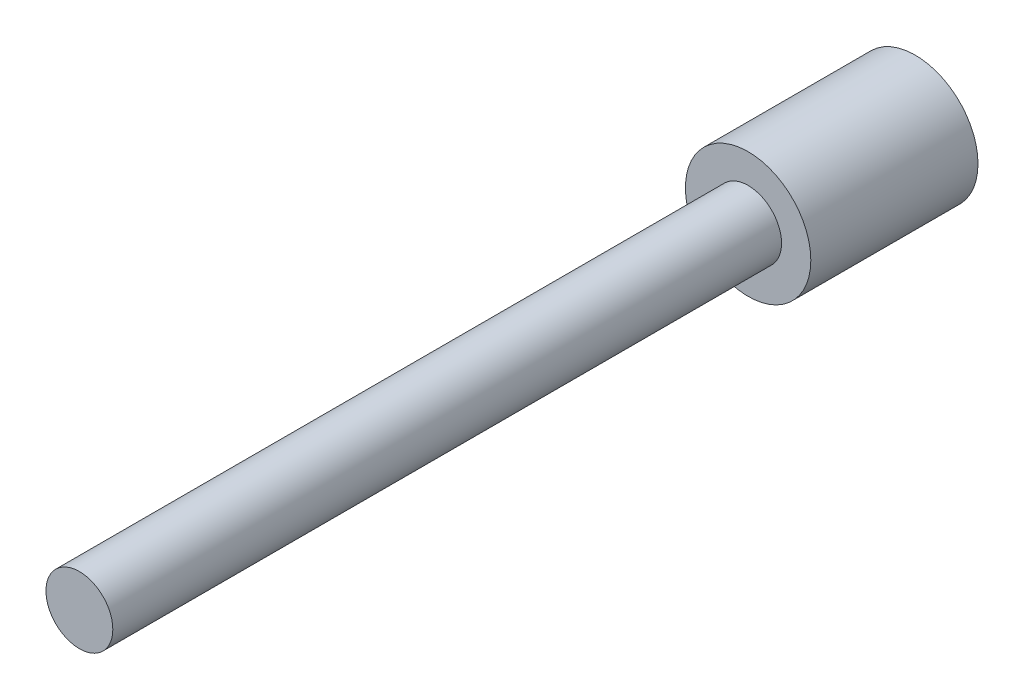
ISO-10303-21;
HEADER;
FILE_DESCRIPTION(('STEP AP214'),'2;1');
FILE_NAME('part.step','',(''),(''),'','','');
FILE_SCHEMA(('AUTOMOTIVE_DESIGN { 1 0 10303 214 1 1 1 1 }'));
ENDSEC;
DATA;
#1=APPLICATION_CONTEXT('core data for automotive mechanical design processes');
#2=APPLICATION_PROTOCOL_DEFINITION('international standard','automotive_design',2000,#1);
#3=PRODUCT_CONTEXT('',#1,'mechanical');
#4=PRODUCT('Part','Part','',(#3));
#5=PRODUCT_RELATED_PRODUCT_CATEGORY('part','',(#4));
#6=PRODUCT_DEFINITION_FORMATION('','',#4);
#7=PRODUCT_DEFINITION_CONTEXT('part definition',#1,'design');
#8=PRODUCT_DEFINITION('design','',#6,#7);
#9=PRODUCT_DEFINITION_SHAPE('','',#8);
#10=(LENGTH_UNIT() NAMED_UNIT(*) SI_UNIT(.MILLI.,.METRE.));
#11=(NAMED_UNIT(*) PLANE_ANGLE_UNIT() SI_UNIT($,.RADIAN.));
#12=(NAMED_UNIT(*) SI_UNIT($,.STERADIAN.) SOLID_ANGLE_UNIT());
#13=UNCERTAINTY_MEASURE_WITH_UNIT(LENGTH_MEASURE(1.E-05),#10,'distance_accuracy_value','');
#14=(GEOMETRIC_REPRESENTATION_CONTEXT(3) GLOBAL_UNCERTAINTY_ASSIGNED_CONTEXT((#13)) GLOBAL_UNIT_ASSIGNED_CONTEXT((#10,
#11,#12)) REPRESENTATION_CONTEXT('',''));
#15=CARTESIAN_POINT('',(0.,0.,0.));
#16=DIRECTION('',(0.,0.,1.));
#17=DIRECTION('',(1.,0.,0.));
#18=AXIS2_PLACEMENT_3D('',#15,#16,#17);
#19=CARTESIAN_POINT('',(0.,0.,20.));
#20=DIRECTION('',(0.,0.,-1.));
#21=DIRECTION('',(-1.,0.,0.));
#22=AXIS2_PLACEMENT_3D('',#19,#20,#21);
#23=CYLINDRICAL_SURFACE('',#22,7.5);
#24=CARTESIAN_POINT('',(0.,0.,20.));
#25=DIRECTION('',(0.,0.,1.));
#26=DIRECTION('',(1.,0.,0.));
#27=AXIS2_PLACEMENT_3D('',#24,#25,#26);
#28=CIRCLE('',#27,7.5);
#29=CARTESIAN_POINT('',(7.5,0.,20.));
#30=VERTEX_POINT('',#29);
#31=EDGE_CURVE('E45',#30,#30,#28,.T.);
#32=ORIENTED_EDGE('',*,*,#31,.F.);
#33=EDGE_LOOP('',(#32));
#34=FACE_BOUND('',#33,.T.);
#35=CARTESIAN_POINT('',(0.,0.,0.));
#36=DIRECTION('',(0.,0.,1.));
#37=DIRECTION('',(1.,0.,0.));
#38=AXIS2_PLACEMENT_3D('',#35,#36,#37);
#39=CIRCLE('',#38,7.5);
#40=CARTESIAN_POINT('',(7.5,0.,0.));
#41=VERTEX_POINT('',#40);
#42=EDGE_CURVE('E40',#41,#41,#39,.T.);
#43=ORIENTED_EDGE('',*,*,#42,.T.);
#44=EDGE_LOOP('',(#43));
#45=FACE_BOUND('',#44,.T.);
#46=ADVANCED_FACE('F37',(#34,#45),#23,.T.);
#47=CARTESIAN_POINT('',(0.,0.,20.));
#48=DIRECTION('',(0.,0.,1.));
#49=DIRECTION('',(1.,0.,0.));
#50=AXIS2_PLACEMENT_3D('',#47,#48,#49);
#51=PLANE('',#50);
#52=CARTESIAN_POINT('',(0.,0.,20.));
#53=DIRECTION('',(0.,0.,1.));
#54=DIRECTION('',(1.,0.,0.));
#55=AXIS2_PLACEMENT_3D('',#52,#53,#54);
#56=CIRCLE('',#55,4.);
#57=CARTESIAN_POINT('',(4.,0.,20.));
#58=VERTEX_POINT('',#57);
#59=EDGE_CURVE('E10',#58,#58,#56,.T.);
#60=ORIENTED_EDGE('',*,*,#59,.F.);
#61=EDGE_LOOP('',(#60));
#62=FACE_BOUND('',#61,.T.);
#63=ORIENTED_EDGE('',*,*,#31,.T.);
#64=EDGE_LOOP('',(#63));
#65=FACE_BOUND('',#64,.T.);
#66=ADVANCED_FACE('F65',(#62,#65),#51,.T.);
#67=CARTESIAN_POINT('',(0.,0.,0.));
#68=DIRECTION('',(0.,0.,1.));
#69=DIRECTION('',(1.,0.,0.));
#70=AXIS2_PLACEMENT_3D('',#67,#68,#69);
#71=PLANE('',#70);
#72=ORIENTED_EDGE('',*,*,#42,.F.);
#73=EDGE_LOOP('',(#72));
#74=FACE_BOUND('',#73,.T.);
#75=ADVANCED_FACE('F62',(#74),#71,.F.);
#76=CARTESIAN_POINT('',(0.,0.,100.));
#77=DIRECTION('',(0.,0.,-1.));
#78=DIRECTION('',(-1.,0.,0.));
#79=AXIS2_PLACEMENT_3D('',#76,#77,#78);
#80=CYLINDRICAL_SURFACE('',#79,4.);
#81=CARTESIAN_POINT('',(0.,0.,100.));
#82=DIRECTION('',(0.,0.,1.));
#83=DIRECTION('',(1.,0.,0.));
#84=AXIS2_PLACEMENT_3D('',#81,#82,#83);
#85=CIRCLE('',#84,4.);
#86=CARTESIAN_POINT('',(4.,0.,100.));
#87=VERTEX_POINT('',#86);
#88=EDGE_CURVE('E52',#87,#87,#85,.T.);
#89=ORIENTED_EDGE('',*,*,#88,.F.);
#90=EDGE_LOOP('',(#89));
#91=FACE_BOUND('',#90,.T.);
#92=ORIENTED_EDGE('',*,*,#59,.T.);
#93=EDGE_LOOP('',(#92));
#94=FACE_BOUND('',#93,.T.);
#95=ADVANCED_FACE('F64',(#91,#94),#80,.T.);
#96=CARTESIAN_POINT('',(0.,0.,100.));
#97=DIRECTION('',(0.,0.,1.));
#98=DIRECTION('',(1.,0.,0.));
#99=AXIS2_PLACEMENT_3D('',#96,#97,#98);
#100=PLANE('',#99);
#101=ORIENTED_EDGE('',*,*,#88,.T.);
#102=EDGE_LOOP('',(#101));
#103=FACE_BOUND('',#102,.T.);
#104=ADVANCED_FACE('F70',(#103),#100,.T.);
#105=CLOSED_SHELL('',(#46,#66,#75,#95,#104));
#106=MANIFOLD_SOLID_BREP('B2',#105);
#107=ADVANCED_BREP_SHAPE_REPRESENTATION('',(#18,#106),#14);
#108=SHAPE_DEFINITION_REPRESENTATION(#9,#107);
ENDSEC;
END-ISO-10303-21;
